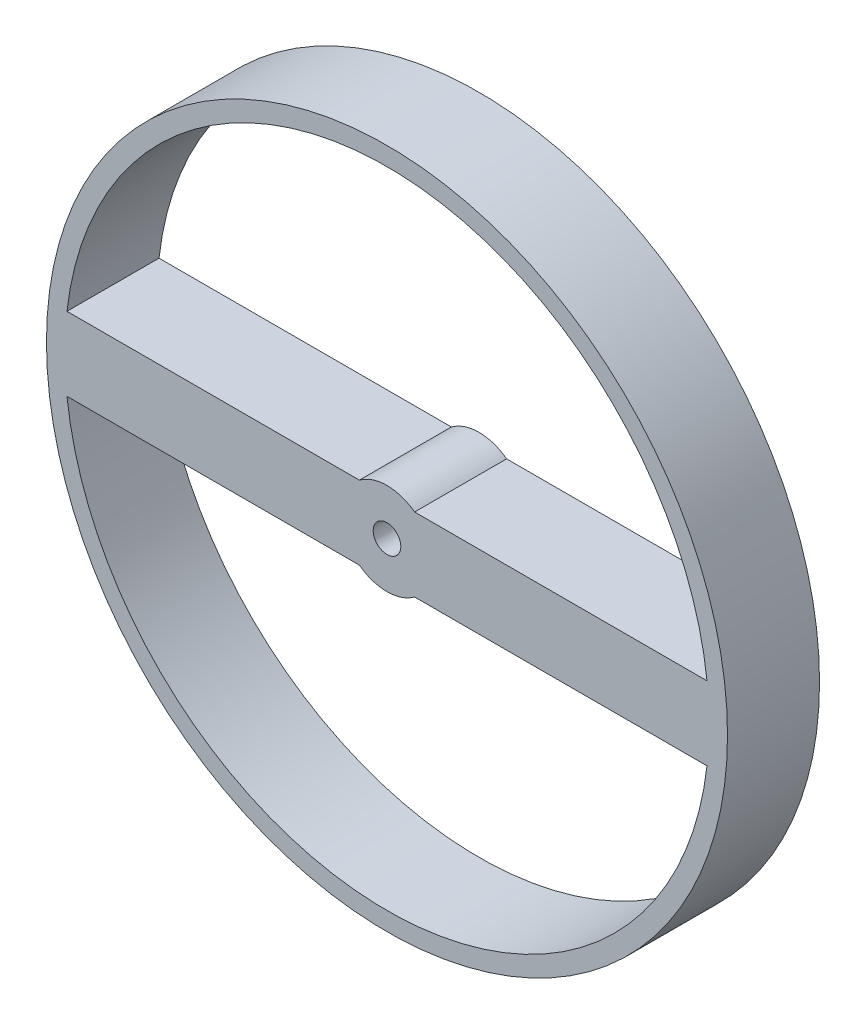
ISO-10303-21;
HEADER;
FILE_DESCRIPTION(('STEP AP214'),'2;1');
FILE_NAME('part.step','',(''),(''),'','','');
FILE_SCHEMA(('AUTOMOTIVE_DESIGN { 1 0 10303 214 1 1 1 1 }'));
ENDSEC;
DATA;
#1=APPLICATION_CONTEXT('core data for automotive mechanical design processes');
#2=APPLICATION_PROTOCOL_DEFINITION('international standard','automotive_design',2000,#1);
#3=PRODUCT_CONTEXT('',#1,'mechanical');
#4=PRODUCT('Part','Part','',(#3));
#5=PRODUCT_RELATED_PRODUCT_CATEGORY('part','',(#4));
#6=PRODUCT_DEFINITION_FORMATION('','',#4);
#7=PRODUCT_DEFINITION_CONTEXT('part definition',#1,'design');
#8=PRODUCT_DEFINITION('design','',#6,#7);
#9=PRODUCT_DEFINITION_SHAPE('','',#8);
#10=(LENGTH_UNIT() NAMED_UNIT(*) SI_UNIT(.MILLI.,.METRE.));
#11=(NAMED_UNIT(*) PLANE_ANGLE_UNIT() SI_UNIT($,.RADIAN.));
#12=(NAMED_UNIT(*) SI_UNIT($,.STERADIAN.) SOLID_ANGLE_UNIT());
#13=UNCERTAINTY_MEASURE_WITH_UNIT(LENGTH_MEASURE(1.E-05),#10,'distance_accuracy_value','');
#14=(GEOMETRIC_REPRESENTATION_CONTEXT(3) GLOBAL_UNCERTAINTY_ASSIGNED_CONTEXT((#13)) GLOBAL_UNIT_ASSIGNED_CONTEXT((#10,
#11,#12)) REPRESENTATION_CONTEXT('',''));
#15=CARTESIAN_POINT('',(0.,0.,0.));
#16=DIRECTION('',(0.,0.,1.));
#17=DIRECTION('',(1.,0.,0.));
#18=AXIS2_PLACEMENT_3D('',#15,#16,#17);
#19=CARTESIAN_POINT('',(-21.3223010861045,7.95883543161344,0.));
#20=DIRECTION('',(0.,0.,1.));
#21=DIRECTION('',(1.,0.,0.));
#22=AXIS2_PLACEMENT_3D('',#19,#20,#21);
#23=CYLINDRICAL_SURFACE('',#22,17.5);
#24=CARTESIAN_POINT('',(-21.3223010861045,7.95883543161344,5.));
#25=DIRECTION('',(0.,0.,1.));
#26=DIRECTION('',(1.,0.,0.));
#27=AXIS2_PLACEMENT_3D('',#24,#25,#26);
#28=CIRCLE('',#27,17.5);
#29=CARTESIAN_POINT('',(-38.7076397368182,5.95883543161344,5.));
#30=VERTEX_POINT('',#29);
#31=CARTESIAN_POINT('',(-3.93696243539077,5.95883543161344,5.));
#32=VERTEX_POINT('',#31);
#33=EDGE_CURVE('E55',#30,#32,#28,.T.);
#34=ORIENTED_EDGE('',*,*,#33,.T.);
#35=DIRECTION('',(0.,0.,1.));
#36=VECTOR('',#35,1.);
#37=CARTESIAN_POINT('',(-3.93696243539077,5.95883543161344,0.));
#38=LINE('',#37,#36);
#39=CARTESIAN_POINT('',(-3.93696243539077,5.95883543161344,0.));
#40=VERTEX_POINT('',#39);
#41=EDGE_CURVE('E122',#32,#40,#38,.F.);
#42=ORIENTED_EDGE('',*,*,#41,.T.);
#43=CARTESIAN_POINT('',(-21.3223010861045,7.95883543161344,0.));
#44=DIRECTION('',(0.,0.,1.));
#45=DIRECTION('',(1.,0.,0.));
#46=AXIS2_PLACEMENT_3D('',#43,#44,#45);
#47=CIRCLE('',#46,17.5);
#48=CARTESIAN_POINT('',(-38.7076397368182,5.95883543161344,0.));
#49=VERTEX_POINT('',#48);
#50=EDGE_CURVE('E115',#49,#40,#47,.T.);
#51=ORIENTED_EDGE('',*,*,#50,.F.);
#52=DIRECTION('',(0.,0.,1.));
#53=VECTOR('',#52,1.);
#54=CARTESIAN_POINT('',(-38.7076397368182,5.95883543161344,0.));
#55=LINE('',#54,#53);
#56=EDGE_CURVE('E189',#30,#49,#55,.F.);
#57=ORIENTED_EDGE('',*,*,#56,.F.);
#58=EDGE_LOOP('',(#34,#42,#51,#57));
#59=FACE_BOUND('',#58,.T.);
#60=ADVANCED_FACE('F39',(#59),#23,.F.);
#61=CARTESIAN_POINT('',(-21.3223010861045,7.95883543161344,0.));
#62=DIRECTION('',(0.,0.,1.));
#63=DIRECTION('',(1.,0.,0.));
#64=AXIS2_PLACEMENT_3D('',#61,#62,#63);
#65=CYLINDRICAL_SURFACE('',#64,2.5);
#66=DIRECTION('',(0.,0.,1.));
#67=VECTOR('',#66,1.);
#68=CARTESIAN_POINT('',(-19.8223010861045,5.95883543161344,0.));
#69=LINE('',#68,#67);
#70=CARTESIAN_POINT('',(-19.8223010861045,5.95883543161344,5.));
#71=VERTEX_POINT('',#70);
#72=CARTESIAN_POINT('',(-19.8223010861045,5.95883543161344,0.));
#73=VERTEX_POINT('',#72);
#74=EDGE_CURVE('E11',#71,#73,#69,.F.);
#75=ORIENTED_EDGE('',*,*,#74,.F.);
#76=CARTESIAN_POINT('',(-21.3223010861045,7.95883543161344,5.));
#77=DIRECTION('',(0.,0.,1.));
#78=DIRECTION('',(1.,0.,0.));
#79=AXIS2_PLACEMENT_3D('',#76,#77,#78);
#80=CIRCLE('',#79,2.5);
#81=CARTESIAN_POINT('',(-22.8223010861045,5.95883543161344,5.));
#82=VERTEX_POINT('',#81);
#83=EDGE_CURVE('E147',#82,#71,#80,.T.);
#84=ORIENTED_EDGE('',*,*,#83,.F.);
#85=DIRECTION('',(0.,0.,1.));
#86=VECTOR('',#85,1.);
#87=CARTESIAN_POINT('',(-22.8223010861045,5.95883543161344,0.));
#88=LINE('',#87,#86);
#89=CARTESIAN_POINT('',(-22.8223010861045,5.95883543161344,0.));
#90=VERTEX_POINT('',#89);
#91=EDGE_CURVE('E155',#90,#82,#88,.T.);
#92=ORIENTED_EDGE('',*,*,#91,.F.);
#93=CARTESIAN_POINT('',(-21.3223010861045,7.95883543161344,0.));
#94=DIRECTION('',(0.,0.,1.));
#95=DIRECTION('',(1.,0.,0.));
#96=AXIS2_PLACEMENT_3D('',#93,#94,#95);
#97=CIRCLE('',#96,2.5);
#98=EDGE_CURVE('E141',#90,#73,#97,.T.);
#99=ORIENTED_EDGE('',*,*,#98,.T.);
#100=EDGE_LOOP('',(#75,#84,#92,#99));
#101=FACE_BOUND('',#100,.T.);
#102=ADVANCED_FACE('F221',(#101),#65,.T.);
#103=CARTESIAN_POINT('',(-3.93696243539077,9.95883543161344,0.));
#104=VERTEX_POINT('',#103);
#105=CARTESIAN_POINT('',(-38.7076397368182,9.95883543161344,0.));
#106=VERTEX_POINT('',#105);
#107=EDGE_CURVE('E63',#104,#106,#47,.T.);
#108=ORIENTED_EDGE('',*,*,#107,.F.);
#109=DIRECTION('',(0.,0.,1.));
#110=VECTOR('',#109,1.);
#111=CARTESIAN_POINT('',(-3.93696243539077,9.95883543161344,0.));
#112=LINE('',#111,#110);
#113=CARTESIAN_POINT('',(-3.93696243539077,9.95883543161344,5.));
#114=VERTEX_POINT('',#113);
#115=EDGE_CURVE('E117',#104,#114,#112,.T.);
#116=ORIENTED_EDGE('',*,*,#115,.T.);
#117=CARTESIAN_POINT('',(-38.7076397368182,9.95883543161344,5.));
#118=VERTEX_POINT('',#117);
#119=EDGE_CURVE('E105',#114,#118,#28,.T.);
#120=ORIENTED_EDGE('',*,*,#119,.T.);
#121=DIRECTION('',(0.,0.,1.));
#122=VECTOR('',#121,1.);
#123=CARTESIAN_POINT('',(-38.7076397368182,9.95883543161344,0.));
#124=LINE('',#123,#122);
#125=EDGE_CURVE('E183',#118,#106,#124,.F.);
#126=ORIENTED_EDGE('',*,*,#125,.T.);
#127=EDGE_LOOP('',(#108,#116,#120,#126));
#128=FACE_BOUND('',#127,.T.);
#129=ADVANCED_FACE('F118',(#128),#23,.F.);
#130=CARTESIAN_POINT('',(-21.3223010861045,7.95883543161344,5.));
#131=DIRECTION('',(0.,0.,-1.));
#132=DIRECTION('',(-1.,0.,0.));
#133=AXIS2_PLACEMENT_3D('',#130,#131,#132);
#134=CYLINDRICAL_SURFACE('',#133,18.5);
#135=CARTESIAN_POINT('',(-21.3223010861045,7.95883543161344,5.));
#136=DIRECTION('',(0.,0.,1.));
#137=DIRECTION('',(1.,0.,0.));
#138=AXIS2_PLACEMENT_3D('',#135,#136,#137);
#139=CIRCLE('',#138,18.5);
#140=CARTESIAN_POINT('',(-2.82230108610448,7.95883543161344,5.));
#141=VERTEX_POINT('',#140);
#142=EDGE_CURVE('E178',#141,#141,#139,.T.);
#143=ORIENTED_EDGE('',*,*,#142,.F.);
#144=EDGE_LOOP('',(#143));
#145=FACE_BOUND('',#144,.T.);
#146=CARTESIAN_POINT('',(-21.3223010861045,7.95883543161344,0.));
#147=DIRECTION('',(0.,0.,1.));
#148=DIRECTION('',(1.,0.,0.));
#149=AXIS2_PLACEMENT_3D('',#146,#147,#148);
#150=CIRCLE('',#149,18.5);
#151=CARTESIAN_POINT('',(-2.82230108610448,7.95883543161344,0.));
#152=VERTEX_POINT('',#151);
#153=EDGE_CURVE('E169',#152,#152,#150,.T.);
#154=ORIENTED_EDGE('',*,*,#153,.T.);
#155=EDGE_LOOP('',(#154));
#156=FACE_BOUND('',#155,.T.);
#157=ADVANCED_FACE('F233',(#145,#156),#134,.T.);
#158=CARTESIAN_POINT('',(-21.3223010861045,7.95883543161344,5.));
#159=DIRECTION('',(0.,0.,1.));
#160=DIRECTION('',(1.,0.,0.));
#161=AXIS2_PLACEMENT_3D('',#158,#159,#160);
#162=PLANE('',#161);
#163=ORIENTED_EDGE('',*,*,#119,.F.);
#164=DIRECTION('',(-1.,0.,0.));
#165=VECTOR('',#164,1.);
#166=CARTESIAN_POINT('',(-2.93072692835496,9.95883543161344,5.));
#167=LINE('',#166,#165);
#168=CARTESIAN_POINT('',(-19.8223010861045,9.95883543161344,5.));
#169=VERTEX_POINT('',#168);
#170=EDGE_CURVE('E109',#114,#169,#167,.T.);
#171=ORIENTED_EDGE('',*,*,#170,.T.);
#172=CARTESIAN_POINT('',(-22.8223010861045,9.95883543161344,5.));
#173=VERTEX_POINT('',#172);
#174=EDGE_CURVE('E140',#169,#173,#80,.T.);
#175=ORIENTED_EDGE('',*,*,#174,.T.);
#176=DIRECTION('',(1.,0.,0.));
#177=VECTOR('',#176,1.);
#178=CARTESIAN_POINT('',(-21.3223010861045,9.95883543161344,5.));
#179=LINE('',#178,#177);
#180=EDGE_CURVE('E112',#118,#173,#179,.T.);
#181=ORIENTED_EDGE('',*,*,#180,.F.);
#182=EDGE_LOOP('',(#163,#171,#175,#181));
#183=FACE_BOUND('',#182,.T.);
#184=ORIENTED_EDGE('',*,*,#142,.T.);
#185=EDGE_LOOP('',(#184));
#186=FACE_BOUND('',#185,.T.);
#187=ORIENTED_EDGE('',*,*,#83,.T.);
#188=DIRECTION('',(1.,0.,0.));
#189=VECTOR('',#188,1.);
#190=CARTESIAN_POINT('',(-2.93072692835496,5.95883543161344,5.));
#191=LINE('',#190,#189);
#192=EDGE_CURVE('E129',#71,#32,#191,.T.);
#193=ORIENTED_EDGE('',*,*,#192,.T.);
#194=ORIENTED_EDGE('',*,*,#33,.F.);
#195=DIRECTION('',(1.,0.,0.));
#196=VECTOR('',#195,1.);
#197=CARTESIAN_POINT('',(-21.3223010861045,5.95883543161344,5.));
#198=LINE('',#197,#196);
#199=EDGE_CURVE('E162',#30,#82,#198,.T.);
#200=ORIENTED_EDGE('',*,*,#199,.T.);
#201=EDGE_LOOP('',(#187,#193,#194,#200));
#202=FACE_BOUND('',#201,.T.);
#203=CARTESIAN_POINT('',(-21.3223010861045,7.95883543161344,5.));
#204=DIRECTION('',(0.,0.,-1.));
#205=DIRECTION('',(-1.,0.,0.));
#206=AXIS2_PLACEMENT_3D('',#203,#204,#205);
#207=CIRCLE('',#206,0.750000000000002);
#208=CARTESIAN_POINT('',(-22.0723010861045,7.95883543161344,5.));
#209=VERTEX_POINT('',#208);
#210=EDGE_CURVE('E151',#209,#209,#207,.T.);
#211=ORIENTED_EDGE('',*,*,#210,.T.);
#212=EDGE_LOOP('',(#211));
#213=FACE_BOUND('',#212,.T.);
#214=ADVANCED_FACE('F106',(#183,#186,#202,#213),#162,.T.);
#215=CARTESIAN_POINT('',(-21.3223010861045,7.95883543161344,0.));
#216=DIRECTION('',(0.,0.,1.));
#217=DIRECTION('',(1.,0.,0.));
#218=AXIS2_PLACEMENT_3D('',#215,#216,#217);
#219=PLANE('',#218);
#220=DIRECTION('',(-1.,0.,0.));
#221=VECTOR('',#220,1.);
#222=CARTESIAN_POINT('',(-2.93072692835496,9.95883543161344,0.));
#223=LINE('',#222,#221);
#224=CARTESIAN_POINT('',(-19.8223010861045,9.95883543161344,0.));
#225=VERTEX_POINT('',#224);
#226=EDGE_CURVE('E133',#104,#225,#223,.T.);
#227=ORIENTED_EDGE('',*,*,#226,.F.);
#228=ORIENTED_EDGE('',*,*,#107,.T.);
#229=DIRECTION('',(1.,0.,0.));
#230=VECTOR('',#229,1.);
#231=CARTESIAN_POINT('',(-21.3223010861045,9.95883543161344,0.));
#232=LINE('',#231,#230);
#233=CARTESIAN_POINT('',(-22.8223010861045,9.95883543161344,0.));
#234=VERTEX_POINT('',#233);
#235=EDGE_CURVE('E166',#106,#234,#232,.T.);
#236=ORIENTED_EDGE('',*,*,#235,.T.);
#237=EDGE_CURVE('E146',#225,#234,#97,.T.);
#238=ORIENTED_EDGE('',*,*,#237,.F.);
#239=EDGE_LOOP('',(#227,#228,#236,#238));
#240=FACE_BOUND('',#239,.T.);
#241=ORIENTED_EDGE('',*,*,#153,.F.);
#242=EDGE_LOOP('',(#241));
#243=FACE_BOUND('',#242,.T.);
#244=DIRECTION('',(1.,0.,0.));
#245=VECTOR('',#244,1.);
#246=CARTESIAN_POINT('',(-2.93072692835496,5.95883543161344,0.));
#247=LINE('',#246,#245);
#248=EDGE_CURVE('E123',#73,#40,#247,.T.);
#249=ORIENTED_EDGE('',*,*,#248,.F.);
#250=ORIENTED_EDGE('',*,*,#98,.F.);
#251=DIRECTION('',(1.,0.,0.));
#252=VECTOR('',#251,1.);
#253=CARTESIAN_POINT('',(-21.3223010861045,5.95883543161344,0.));
#254=LINE('',#253,#252);
#255=EDGE_CURVE('E161',#49,#90,#254,.T.);
#256=ORIENTED_EDGE('',*,*,#255,.F.);
#257=ORIENTED_EDGE('',*,*,#50,.T.);
#258=EDGE_LOOP('',(#249,#250,#256,#257));
#259=FACE_BOUND('',#258,.T.);
#260=CARTESIAN_POINT('',(-21.3223010861045,7.95883543161344,0.));
#261=DIRECTION('',(0.,0.,-1.));
#262=DIRECTION('',(-1.,0.,0.));
#263=AXIS2_PLACEMENT_3D('',#260,#261,#262);
#264=CIRCLE('',#263,0.750000000000002);
#265=CARTESIAN_POINT('',(-22.0723010861045,7.95883543161344,0.));
#266=VERTEX_POINT('',#265);
#267=EDGE_CURVE('E145',#266,#266,#264,.T.);
#268=ORIENTED_EDGE('',*,*,#267,.F.);
#269=EDGE_LOOP('',(#268));
#270=FACE_BOUND('',#269,.T.);
#271=ADVANCED_FACE('F41',(#240,#243,#259,#270),#219,.F.);
#272=CARTESIAN_POINT('',(-21.3223010861045,5.95883543161344,5.));
#273=DIRECTION('',(0.,1.,0.));
#274=DIRECTION('',(0.,0.,1.));
#275=AXIS2_PLACEMENT_3D('',#272,#273,#274);
#276=PLANE('',#275);
#277=ORIENTED_EDGE('',*,*,#255,.T.);
#278=ORIENTED_EDGE('',*,*,#91,.T.);
#279=ORIENTED_EDGE('',*,*,#199,.F.);
#280=ORIENTED_EDGE('',*,*,#56,.T.);
#281=EDGE_LOOP('',(#277,#278,#279,#280));
#282=FACE_BOUND('',#281,.T.);
#283=ADVANCED_FACE('F213',(#282),#276,.F.);
#284=CARTESIAN_POINT('',(-21.3223010861045,9.95883543161344,5.));
#285=DIRECTION('',(0.,1.,0.));
#286=DIRECTION('',(0.,0.,1.));
#287=AXIS2_PLACEMENT_3D('',#284,#285,#286);
#288=PLANE('',#287);
#289=DIRECTION('',(0.,0.,1.));
#290=VECTOR('',#289,1.);
#291=CARTESIAN_POINT('',(-22.8223010861045,9.95883543161344,0.));
#292=LINE('',#291,#290);
#293=EDGE_CURVE('E193',#234,#173,#292,.T.);
#294=ORIENTED_EDGE('',*,*,#293,.F.);
#295=ORIENTED_EDGE('',*,*,#235,.F.);
#296=ORIENTED_EDGE('',*,*,#125,.F.);
#297=ORIENTED_EDGE('',*,*,#180,.T.);
#298=EDGE_LOOP('',(#294,#295,#296,#297));
#299=FACE_BOUND('',#298,.T.);
#300=ADVANCED_FACE('F211',(#299),#288,.T.);
#301=DIRECTION('',(0.,0.,1.));
#302=VECTOR('',#301,1.);
#303=CARTESIAN_POINT('',(-19.8223010861045,9.95883543161344,0.));
#304=LINE('',#303,#302);
#305=EDGE_CURVE('E48',#225,#169,#304,.T.);
#306=ORIENTED_EDGE('',*,*,#305,.F.);
#307=ORIENTED_EDGE('',*,*,#237,.T.);
#308=ORIENTED_EDGE('',*,*,#293,.T.);
#309=ORIENTED_EDGE('',*,*,#174,.F.);
#310=EDGE_LOOP('',(#306,#307,#308,#309));
#311=FACE_BOUND('',#310,.T.);
#312=ADVANCED_FACE('F206',(#311),#65,.T.);
#313=CARTESIAN_POINT('',(-21.3223010861045,7.95883543161344,5.));
#314=DIRECTION('',(0.,0.,-1.));
#315=DIRECTION('',(-1.,0.,0.));
#316=AXIS2_PLACEMENT_3D('',#313,#314,#315);
#317=CYLINDRICAL_SURFACE('',#316,0.750000000000002);
#318=ORIENTED_EDGE('',*,*,#210,.F.);
#319=EDGE_LOOP('',(#318));
#320=FACE_BOUND('',#319,.T.);
#321=ORIENTED_EDGE('',*,*,#267,.T.);
#322=EDGE_LOOP('',(#321));
#323=FACE_BOUND('',#322,.T.);
#324=ADVANCED_FACE('F219',(#320,#323),#317,.F.);
#325=CARTESIAN_POINT('',(-2.93072692835496,5.95883543161344,0.));
#326=DIRECTION('',(0.,-1.,0.));
#327=DIRECTION('',(0.,0.,-1.));
#328=AXIS2_PLACEMENT_3D('',#325,#326,#327);
#329=PLANE('',#328);
#330=ORIENTED_EDGE('',*,*,#41,.F.);
#331=ORIENTED_EDGE('',*,*,#192,.F.);
#332=ORIENTED_EDGE('',*,*,#74,.T.);
#333=ORIENTED_EDGE('',*,*,#248,.T.);
#334=EDGE_LOOP('',(#330,#331,#332,#333));
#335=FACE_BOUND('',#334,.T.);
#336=ADVANCED_FACE('F252',(#335),#329,.T.);
#337=CARTESIAN_POINT('',(-2.93072692835496,9.95883543161344,0.));
#338=DIRECTION('',(0.,1.,0.));
#339=DIRECTION('',(0.,0.,1.));
#340=AXIS2_PLACEMENT_3D('',#337,#338,#339);
#341=PLANE('',#340);
#342=ORIENTED_EDGE('',*,*,#115,.F.);
#343=ORIENTED_EDGE('',*,*,#226,.T.);
#344=ORIENTED_EDGE('',*,*,#305,.T.);
#345=ORIENTED_EDGE('',*,*,#170,.F.);
#346=EDGE_LOOP('',(#342,#343,#344,#345));
#347=FACE_BOUND('',#346,.T.);
#348=ADVANCED_FACE('F125',(#347),#341,.T.);
#349=CLOSED_SHELL('',(#60,#102,#129,#157,#214,#271,#283,#300,#312,#324,#336,#348));
#350=MANIFOLD_SOLID_BREP('B2',#349);
#351=ADVANCED_BREP_SHAPE_REPRESENTATION('',(#18,#350),#14);
#352=SHAPE_DEFINITION_REPRESENTATION(#9,#351);
ENDSEC;
END-ISO-10303-21;
